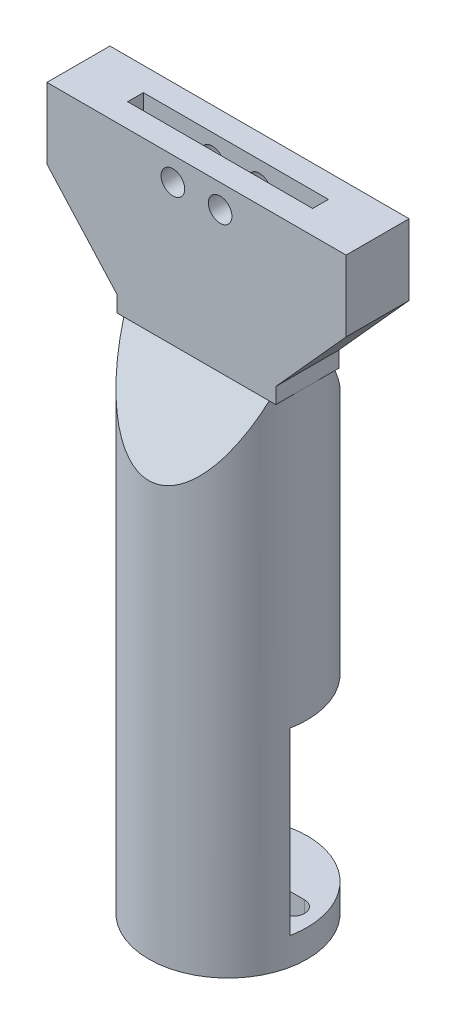
ISO-10303-21;
HEADER;
FILE_DESCRIPTION(('STEP AP214'),'2;1');
FILE_NAME('part.step','',(''),(''),'','','');
FILE_SCHEMA(('AUTOMOTIVE_DESIGN { 1 0 10303 214 1 1 1 1 }'));
ENDSEC;
DATA;
#1=APPLICATION_CONTEXT('core data for automotive mechanical design processes');
#2=APPLICATION_PROTOCOL_DEFINITION('international standard','automotive_design',2000,#1);
#3=PRODUCT_CONTEXT('',#1,'mechanical');
#4=PRODUCT('Part','Part','',(#3));
#5=PRODUCT_RELATED_PRODUCT_CATEGORY('part','',(#4));
#6=PRODUCT_DEFINITION_FORMATION('','',#4);
#7=PRODUCT_DEFINITION_CONTEXT('part definition',#1,'design');
#8=PRODUCT_DEFINITION('design','',#6,#7);
#9=PRODUCT_DEFINITION_SHAPE('','',#8);
#10=(LENGTH_UNIT() NAMED_UNIT(*) SI_UNIT(.MILLI.,.METRE.));
#11=(NAMED_UNIT(*) PLANE_ANGLE_UNIT() SI_UNIT($,.RADIAN.));
#12=(NAMED_UNIT(*) SI_UNIT($,.STERADIAN.) SOLID_ANGLE_UNIT());
#13=UNCERTAINTY_MEASURE_WITH_UNIT(LENGTH_MEASURE(1.E-05),#10,'distance_accuracy_value','');
#14=(GEOMETRIC_REPRESENTATION_CONTEXT(3) GLOBAL_UNCERTAINTY_ASSIGNED_CONTEXT((#13)) GLOBAL_UNIT_ASSIGNED_CONTEXT((#10,
#11,#12)) REPRESENTATION_CONTEXT('',''));
#15=CARTESIAN_POINT('',(0.,0.,0.));
#16=DIRECTION('',(0.,0.,1.));
#17=DIRECTION('',(1.,0.,0.));
#18=AXIS2_PLACEMENT_3D('',#15,#16,#17);
#19=CARTESIAN_POINT('',(19.,-83.9189161372576,4.));
#20=DIRECTION('',(0.,1.,0.));
#21=DIRECTION('',(-1.,0.,0.));
#22=AXIS2_PLACEMENT_3D('',#19,#20,#21);
#23=CYLINDRICAL_SURFACE('',#22,10.0689677949621);
#24=CARTESIAN_POINT('',(19.,-14.0958909977256,4.));
#25=DIRECTION('',(0.,0.505747316246845,-0.862681663250769));
#26=DIRECTION('',(0.,0.862681663250769,0.505747316246845));
#27=AXIS2_PLACEMENT_3D('',#24,#25,#26);
#28=ELLIPSE('',#27,19.9090879407607,10.0689677949621);
#29=CARTESIAN_POINT('',(28.2403523989069,-20.9189161372576,0.));
#30=VERTEX_POINT('',#29);
#31=CARTESIAN_POINT('',(9.75964760109312,-20.9189161372576,0.));
#32=VERTEX_POINT('',#31);
#33=EDGE_CURVE('E337',#30,#32,#28,.T.);
#34=ORIENTED_EDGE('',*,*,#33,.F.);
#35=CARTESIAN_POINT('',(19.,-20.9189161372576,4.));
#36=DIRECTION('',(0.,-1.,0.));
#37=DIRECTION('',(1.,0.,0.));
#38=AXIS2_PLACEMENT_3D('',#35,#36,#37);
#39=CIRCLE('',#38,10.0689677949621);
#40=CARTESIAN_POINT('',(29.0689677949621,-20.9189161372576,4.));
#41=VERTEX_POINT('',#40);
#42=EDGE_CURVE('E271',#30,#41,#39,.T.);
#43=ORIENTED_EDGE('',*,*,#42,.T.);
#44=CARTESIAN_POINT('',(28.2403523989069,-20.9189161372576,8.));
#45=VERTEX_POINT('',#44);
#46=EDGE_CURVE('E263',#41,#45,#39,.T.);
#47=ORIENTED_EDGE('',*,*,#46,.T.);
#48=CARTESIAN_POINT('',(19.,-14.0958909977256,4.));
#49=DIRECTION('',(0.,0.505747316246845,0.862681663250769));
#50=DIRECTION('',(0.,0.862681663250769,-0.505747316246845));
#51=AXIS2_PLACEMENT_3D('',#48,#49,#50);
#52=ELLIPSE('',#51,19.9090879407607,10.0689677949621);
#53=CARTESIAN_POINT('',(9.75964760109309,-20.9189161372576,8.));
#54=VERTEX_POINT('',#53);
#55=EDGE_CURVE('E261',#54,#45,#52,.T.);
#56=ORIENTED_EDGE('',*,*,#55,.F.);
#57=CARTESIAN_POINT('',(8.93103220503786,-20.9189161372576,4.));
#58=VERTEX_POINT('',#57);
#59=EDGE_CURVE('E270',#54,#58,#39,.T.);
#60=ORIENTED_EDGE('',*,*,#59,.T.);
#61=EDGE_CURVE('E443',#58,#32,#39,.T.);
#62=ORIENTED_EDGE('',*,*,#61,.T.);
#63=EDGE_LOOP('',(#34,#43,#47,#56,#60,#62));
#64=FACE_BOUND('',#63,.T.);
#65=CARTESIAN_POINT('',(19.,-83.9189161372576,4.));
#66=DIRECTION('',(0.,-1.,0.));
#67=DIRECTION('',(1.,0.,0.));
#68=AXIS2_PLACEMENT_3D('',#65,#66,#67);
#69=CIRCLE('',#68,10.0689677949621);
#70=CARTESIAN_POINT('',(29.0689677949621,-83.9189161372576,4.));
#71=VERTEX_POINT('',#70);
#72=EDGE_CURVE('E264',#71,#71,#69,.T.);
#73=ORIENTED_EDGE('',*,*,#72,.F.);
#74=EDGE_LOOP('',(#73));
#75=FACE_BOUND('',#74,.T.);
#76=DIRECTION('',(0.,1.,0.));
#77=VECTOR('',#76,1.);
#78=CARTESIAN_POINT('',(28.8646845317479,-83.9189161372576,6.01794735934259));
#79=LINE('',#78,#77);
#80=CARTESIAN_POINT('',(28.8646845317479,-57.5950061167622,6.01794735934259));
#81=VERTEX_POINT('',#80);
#82=CARTESIAN_POINT('',(28.8646845317479,-80.4189161372576,6.01794735934259));
#83=VERTEX_POINT('',#82);
#84=EDGE_CURVE('E345',#81,#83,#79,.F.);
#85=ORIENTED_EDGE('',*,*,#84,.F.);
#86=CARTESIAN_POINT('',(19.,-57.5950061167622,4.));
#87=DIRECTION('',(0.,-1.,0.));
#88=DIRECTION('',(0.,0.,-1.));
#89=AXIS2_PLACEMENT_3D('',#86,#87,#88);
#90=CIRCLE('',#89,10.0689677949621);
#91=CARTESIAN_POINT('',(9.13531546825209,-57.5950061167622,6.01794735934259));
#92=VERTEX_POINT('',#91);
#93=EDGE_CURVE('E350',#92,#81,#90,.T.);
#94=ORIENTED_EDGE('',*,*,#93,.F.);
#95=DIRECTION('',(0.,1.,0.));
#96=VECTOR('',#95,1.);
#97=CARTESIAN_POINT('',(9.13531546825208,-83.9189161372576,6.01794735934259));
#98=LINE('',#97,#96);
#99=CARTESIAN_POINT('',(9.13531546825208,-80.4189161372576,6.01794735934259));
#100=VERTEX_POINT('',#99);
#101=EDGE_CURVE('E348',#100,#92,#98,.T.);
#102=ORIENTED_EDGE('',*,*,#101,.F.);
#103=CARTESIAN_POINT('',(19.,-80.4189161372576,4.));
#104=DIRECTION('',(0.,1.,0.));
#105=DIRECTION('',(0.,0.,1.));
#106=AXIS2_PLACEMENT_3D('',#103,#104,#105);
#107=CIRCLE('',#106,10.0689677949621);
#108=EDGE_CURVE('E339',#83,#100,#107,.T.);
#109=ORIENTED_EDGE('',*,*,#108,.F.);
#110=EDGE_LOOP('',(#85,#94,#102,#109));
#111=FACE_BOUND('',#110,.T.);
#112=ADVANCED_FACE('F33',(#64,#75,#111),#23,.T.);
#113=CARTESIAN_POINT('',(16.,-3.,10.));
#114=DIRECTION('',(0.,0.,-1.));
#115=DIRECTION('',(-1.,0.,0.));
#116=AXIS2_PLACEMENT_3D('',#113,#114,#115);
#117=CYLINDRICAL_SURFACE('',#116,1.5);
#118=CARTESIAN_POINT('',(16.,-3.,3.));
#119=DIRECTION('',(0.,0.,-1.));
#120=DIRECTION('',(-1.,0.,0.));
#121=AXIS2_PLACEMENT_3D('',#118,#119,#120);
#122=CIRCLE('',#121,1.5);
#123=CARTESIAN_POINT('',(14.5,-3.,3.));
#124=VERTEX_POINT('',#123);
#125=EDGE_CURVE('E246',#124,#124,#122,.F.);
#126=ORIENTED_EDGE('',*,*,#125,.T.);
#127=EDGE_LOOP('',(#126));
#128=FACE_BOUND('',#127,.T.);
#129=CARTESIAN_POINT('',(16.,-3.,0.));
#130=DIRECTION('',(0.,0.,-1.));
#131=DIRECTION('',(-1.,0.,0.));
#132=AXIS2_PLACEMENT_3D('',#129,#130,#131);
#133=CIRCLE('',#132,1.5);
#134=CARTESIAN_POINT('',(14.5,-3.,0.));
#135=VERTEX_POINT('',#134);
#136=EDGE_CURVE('E249',#135,#135,#133,.T.);
#137=ORIENTED_EDGE('',*,*,#136,.T.);
#138=EDGE_LOOP('',(#137));
#139=FACE_BOUND('',#138,.T.);
#140=ADVANCED_FACE('F374',(#128,#139),#117,.F.);
#141=CARTESIAN_POINT('',(22.,-3.,10.));
#142=DIRECTION('',(0.,0.,-1.));
#143=DIRECTION('',(-1.,0.,0.));
#144=AXIS2_PLACEMENT_3D('',#141,#142,#143);
#145=CYLINDRICAL_SURFACE('',#144,1.5);
#146=CARTESIAN_POINT('',(22.,-3.,3.));
#147=DIRECTION('',(0.,0.,-1.));
#148=DIRECTION('',(-1.,0.,0.));
#149=AXIS2_PLACEMENT_3D('',#146,#147,#148);
#150=CIRCLE('',#149,1.5);
#151=CARTESIAN_POINT('',(20.5,-3.,3.));
#152=VERTEX_POINT('',#151);
#153=EDGE_CURVE('E245',#152,#152,#150,.F.);
#154=ORIENTED_EDGE('',*,*,#153,.T.);
#155=EDGE_LOOP('',(#154));
#156=FACE_BOUND('',#155,.T.);
#157=CARTESIAN_POINT('',(22.,-3.,0.));
#158=DIRECTION('',(0.,0.,-1.));
#159=DIRECTION('',(-1.,0.,0.));
#160=AXIS2_PLACEMENT_3D('',#157,#158,#159);
#161=CIRCLE('',#160,1.5);
#162=CARTESIAN_POINT('',(20.5,-3.,0.));
#163=VERTEX_POINT('',#162);
#164=EDGE_CURVE('E250',#163,#163,#161,.T.);
#165=ORIENTED_EDGE('',*,*,#164,.T.);
#166=EDGE_LOOP('',(#165));
#167=FACE_BOUND('',#166,.T.);
#168=ADVANCED_FACE('F380',(#156,#167),#145,.F.);
#169=CARTESIAN_POINT('',(8.93103220503786,-20.9189161372576,8.));
#170=DIRECTION('',(0.,1.,0.));
#171=DIRECTION('',(-1.,0.,0.));
#172=AXIS2_PLACEMENT_3D('',#169,#170,#171);
#173=PLANE('',#172);
#174=ORIENTED_EDGE('',*,*,#59,.F.);
#175=DIRECTION('',(1.,0.,0.));
#176=VECTOR('',#175,1.);
#177=CARTESIAN_POINT('',(8.93103220503786,-20.9189161372576,8.));
#178=LINE('',#177,#176);
#179=CARTESIAN_POINT('',(8.93103220503786,-20.9189161372576,8.));
#180=VERTEX_POINT('',#179);
#181=EDGE_CURVE('E281',#180,#54,#178,.T.);
#182=ORIENTED_EDGE('',*,*,#181,.F.);
#183=DIRECTION('',(0.,0.,-1.));
#184=VECTOR('',#183,1.);
#185=CARTESIAN_POINT('',(8.93103220503786,-20.9189161372576,8.));
#186=LINE('',#185,#184);
#187=EDGE_CURVE('E328',#180,#58,#186,.T.);
#188=ORIENTED_EDGE('',*,*,#187,.T.);
#189=EDGE_LOOP('',(#174,#182,#188));
#190=FACE_BOUND('',#189,.T.);
#191=ADVANCED_FACE('F417',(#190),#173,.F.);
#192=ORIENTED_EDGE('',*,*,#61,.F.);
#193=CARTESIAN_POINT('',(8.93103220503786,-20.9189161372576,0.));
#194=VERTEX_POINT('',#193);
#195=EDGE_CURVE('E327',#58,#194,#186,.T.);
#196=ORIENTED_EDGE('',*,*,#195,.T.);
#197=DIRECTION('',(1.,0.,0.));
#198=VECTOR('',#197,1.);
#199=CARTESIAN_POINT('',(8.93103220503786,-20.9189161372576,0.));
#200=LINE('',#199,#198);
#201=EDGE_CURVE('E302',#194,#32,#200,.T.);
#202=ORIENTED_EDGE('',*,*,#201,.T.);
#203=EDGE_LOOP('',(#192,#196,#202));
#204=FACE_BOUND('',#203,.T.);
#205=ADVANCED_FACE('F442',(#204),#173,.F.);
#206=ORIENTED_EDGE('',*,*,#46,.F.);
#207=DIRECTION('',(0.,0.,-1.));
#208=VECTOR('',#207,1.);
#209=CARTESIAN_POINT('',(29.0689677949621,-20.9189161372576,8.));
#210=LINE('',#209,#208);
#211=CARTESIAN_POINT('',(29.0689677949621,-20.9189161372576,8.));
#212=VERTEX_POINT('',#211);
#213=EDGE_CURVE('E325',#212,#41,#210,.T.);
#214=ORIENTED_EDGE('',*,*,#213,.F.);
#215=EDGE_CURVE('E280',#45,#212,#178,.T.);
#216=ORIENTED_EDGE('',*,*,#215,.F.);
#217=EDGE_LOOP('',(#206,#214,#216));
#218=FACE_BOUND('',#217,.T.);
#219=ADVANCED_FACE('F418',(#218),#173,.F.);
#220=CARTESIAN_POINT('',(0.,0.,8.));
#221=DIRECTION('',(1.,0.,0.));
#222=DIRECTION('',(0.,1.,0.));
#223=AXIS2_PLACEMENT_3D('',#220,#221,#222);
#224=PLANE('',#223);
#225=DIRECTION('',(0.,-1.,0.));
#226=VECTOR('',#225,1.);
#227=CARTESIAN_POINT('',(0.,0.,0.));
#228=LINE('',#227,#226);
#229=CARTESIAN_POINT('',(0.,0.,0.));
#230=VERTEX_POINT('',#229);
#231=CARTESIAN_POINT('',(0.,-9.,0.));
#232=VERTEX_POINT('',#231);
#233=EDGE_CURVE('E267',#230,#232,#228,.T.);
#234=ORIENTED_EDGE('',*,*,#233,.T.);
#235=DIRECTION('',(0.,0.,-1.));
#236=VECTOR('',#235,1.);
#237=CARTESIAN_POINT('',(0.,-9.,8.));
#238=LINE('',#237,#236);
#239=CARTESIAN_POINT('',(0.,-9.,8.));
#240=VERTEX_POINT('',#239);
#241=EDGE_CURVE('E334',#240,#232,#238,.T.);
#242=ORIENTED_EDGE('',*,*,#241,.F.);
#243=DIRECTION('',(0.,-1.,0.));
#244=VECTOR('',#243,1.);
#245=CARTESIAN_POINT('',(0.,0.,8.));
#246=LINE('',#245,#244);
#247=CARTESIAN_POINT('',(0.,0.,8.));
#248=VERTEX_POINT('',#247);
#249=EDGE_CURVE('E272',#248,#240,#246,.T.);
#250=ORIENTED_EDGE('',*,*,#249,.F.);
#251=DIRECTION('',(0.,0.,-1.));
#252=VECTOR('',#251,1.);
#253=CARTESIAN_POINT('',(0.,0.,8.));
#254=LINE('',#253,#252);
#255=EDGE_CURVE('E293',#248,#230,#254,.T.);
#256=ORIENTED_EDGE('',*,*,#255,.T.);
#257=EDGE_LOOP('',(#234,#242,#250,#256));
#258=FACE_BOUND('',#257,.T.);
#259=ADVANCED_FACE('F35',(#258),#224,.F.);
#260=CARTESIAN_POINT('',(0.,-9.,8.));
#261=DIRECTION('',(0.743144825477395,0.669130606358857,0.));
#262=DIRECTION('',(-0.669130606358857,0.743144825477395,0.));
#263=AXIS2_PLACEMENT_3D('',#260,#261,#262);
#264=PLANE('',#263);
#265=DIRECTION('',(0.669130606358857,-0.743144825477395,0.));
#266=VECTOR('',#265,1.);
#267=CARTESIAN_POINT('',(0.,-9.,0.));
#268=LINE('',#267,#266);
#269=CARTESIAN_POINT('',(8.93103220503786,-18.9189161372576,0.));
#270=VERTEX_POINT('',#269);
#271=EDGE_CURVE('E296',#232,#270,#268,.T.);
#272=ORIENTED_EDGE('',*,*,#271,.T.);
#273=DIRECTION('',(0.,0.,-1.));
#274=VECTOR('',#273,1.);
#275=CARTESIAN_POINT('',(8.93103220503786,-18.9189161372576,8.));
#276=LINE('',#275,#274);
#277=CARTESIAN_POINT('',(8.93103220503786,-18.9189161372576,8.));
#278=VERTEX_POINT('',#277);
#279=EDGE_CURVE('E331',#278,#270,#276,.T.);
#280=ORIENTED_EDGE('',*,*,#279,.F.);
#281=DIRECTION('',(0.669130606358857,-0.743144825477395,0.));
#282=VECTOR('',#281,1.);
#283=CARTESIAN_POINT('',(0.,-9.,8.));
#284=LINE('',#283,#282);
#285=EDGE_CURVE('E275',#240,#278,#284,.T.);
#286=ORIENTED_EDGE('',*,*,#285,.F.);
#287=ORIENTED_EDGE('',*,*,#241,.T.);
#288=EDGE_LOOP('',(#272,#280,#286,#287));
#289=FACE_BOUND('',#288,.T.);
#290=ADVANCED_FACE('F420',(#289),#264,.F.);
#291=CARTESIAN_POINT('',(8.93103220503786,-18.9189161372576,8.));
#292=DIRECTION('',(1.,0.,0.));
#293=DIRECTION('',(0.,1.,0.));
#294=AXIS2_PLACEMENT_3D('',#291,#292,#293);
#295=PLANE('',#294);
#296=DIRECTION('',(0.,-1.,0.));
#297=VECTOR('',#296,1.);
#298=CARTESIAN_POINT('',(8.93103220503786,-18.9189161372576,0.));
#299=LINE('',#298,#297);
#300=EDGE_CURVE('E298',#270,#194,#299,.T.);
#301=ORIENTED_EDGE('',*,*,#300,.T.);
#302=ORIENTED_EDGE('',*,*,#195,.F.);
#303=ORIENTED_EDGE('',*,*,#187,.F.);
#304=DIRECTION('',(0.,-1.,0.));
#305=VECTOR('',#304,1.);
#306=CARTESIAN_POINT('',(8.93103220503786,-18.9189161372576,8.));
#307=LINE('',#306,#305);
#308=EDGE_CURVE('E278',#278,#180,#307,.T.);
#309=ORIENTED_EDGE('',*,*,#308,.F.);
#310=ORIENTED_EDGE('',*,*,#279,.T.);
#311=EDGE_LOOP('',(#301,#302,#303,#309,#310));
#312=FACE_BOUND('',#311,.T.);
#313=ADVANCED_FACE('F415',(#312),#295,.F.);
#314=ORIENTED_EDGE('',*,*,#42,.F.);
#315=CARTESIAN_POINT('',(29.0689677949621,-20.9189161372576,0.));
#316=VERTEX_POINT('',#315);
#317=EDGE_CURVE('E301',#30,#316,#200,.T.);
#318=ORIENTED_EDGE('',*,*,#317,.T.);
#319=EDGE_CURVE('E324',#41,#316,#210,.T.);
#320=ORIENTED_EDGE('',*,*,#319,.F.);
#321=EDGE_LOOP('',(#314,#318,#320));
#322=FACE_BOUND('',#321,.T.);
#323=ADVANCED_FACE('F411',(#322),#173,.F.);
#324=CARTESIAN_POINT('',(29.0689677949621,-18.9189161372576,8.));
#325=DIRECTION('',(-1.,0.,0.));
#326=DIRECTION('',(0.,0.,1.));
#327=AXIS2_PLACEMENT_3D('',#324,#325,#326);
#328=PLANE('',#327);
#329=DIRECTION('',(0.,1.,0.));
#330=VECTOR('',#329,1.);
#331=CARTESIAN_POINT('',(29.0689677949621,-18.9189161372576,0.));
#332=LINE('',#331,#330);
#333=CARTESIAN_POINT('',(29.0689677949621,-18.9189161372576,0.));
#334=VERTEX_POINT('',#333);
#335=EDGE_CURVE('E305',#316,#334,#332,.T.);
#336=ORIENTED_EDGE('',*,*,#335,.T.);
#337=DIRECTION('',(0.,0.,-1.));
#338=VECTOR('',#337,1.);
#339=CARTESIAN_POINT('',(29.0689677949621,-18.9189161372576,8.));
#340=LINE('',#339,#338);
#341=CARTESIAN_POINT('',(29.0689677949621,-18.9189161372576,8.));
#342=VERTEX_POINT('',#341);
#343=EDGE_CURVE('E321',#342,#334,#340,.T.);
#344=ORIENTED_EDGE('',*,*,#343,.F.);
#345=DIRECTION('',(0.,1.,0.));
#346=VECTOR('',#345,1.);
#347=CARTESIAN_POINT('',(29.0689677949621,-18.9189161372576,8.));
#348=LINE('',#347,#346);
#349=EDGE_CURVE('E284',#212,#342,#348,.T.);
#350=ORIENTED_EDGE('',*,*,#349,.F.);
#351=ORIENTED_EDGE('',*,*,#213,.T.);
#352=ORIENTED_EDGE('',*,*,#319,.T.);
#353=EDGE_LOOP('',(#336,#344,#350,#351,#352));
#354=FACE_BOUND('',#353,.T.);
#355=ADVANCED_FACE('F407',(#354),#328,.F.);
#356=CARTESIAN_POINT('',(38.,-9.,8.));
#357=DIRECTION('',(-0.743144825477395,0.669130606358857,0.));
#358=DIRECTION('',(-0.669130606358857,-0.743144825477395,0.));
#359=AXIS2_PLACEMENT_3D('',#356,#357,#358);
#360=PLANE('',#359);
#361=DIRECTION('',(0.669130606358857,0.743144825477395,0.));
#362=VECTOR('',#361,1.);
#363=CARTESIAN_POINT('',(38.,-9.,0.));
#364=LINE('',#363,#362);
#365=CARTESIAN_POINT('',(38.,-9.,0.));
#366=VERTEX_POINT('',#365);
#367=EDGE_CURVE('E308',#334,#366,#364,.T.);
#368=ORIENTED_EDGE('',*,*,#367,.T.);
#369=DIRECTION('',(0.,0.,-1.));
#370=VECTOR('',#369,1.);
#371=CARTESIAN_POINT('',(38.,-9.,8.));
#372=LINE('',#371,#370);
#373=CARTESIAN_POINT('',(38.,-9.,8.));
#374=VERTEX_POINT('',#373);
#375=EDGE_CURVE('E318',#374,#366,#372,.T.);
#376=ORIENTED_EDGE('',*,*,#375,.F.);
#377=DIRECTION('',(0.669130606358857,0.743144825477395,0.));
#378=VECTOR('',#377,1.);
#379=CARTESIAN_POINT('',(38.,-9.,8.));
#380=LINE('',#379,#378);
#381=EDGE_CURVE('E287',#342,#374,#380,.T.);
#382=ORIENTED_EDGE('',*,*,#381,.F.);
#383=ORIENTED_EDGE('',*,*,#343,.T.);
#384=EDGE_LOOP('',(#368,#376,#382,#383));
#385=FACE_BOUND('',#384,.T.);
#386=ADVANCED_FACE('F403',(#385),#360,.F.);
#387=CARTESIAN_POINT('',(38.,0.,8.));
#388=DIRECTION('',(-1.,0.,0.));
#389=DIRECTION('',(0.,0.,1.));
#390=AXIS2_PLACEMENT_3D('',#387,#388,#389);
#391=PLANE('',#390);
#392=DIRECTION('',(0.,1.,0.));
#393=VECTOR('',#392,1.);
#394=CARTESIAN_POINT('',(38.,0.,0.));
#395=LINE('',#394,#393);
#396=CARTESIAN_POINT('',(38.,0.,0.));
#397=VERTEX_POINT('',#396);
#398=EDGE_CURVE('E310',#366,#397,#395,.T.);
#399=ORIENTED_EDGE('',*,*,#398,.T.);
#400=DIRECTION('',(0.,0.,-1.));
#401=VECTOR('',#400,1.);
#402=CARTESIAN_POINT('',(38.,0.,8.));
#403=LINE('',#402,#401);
#404=CARTESIAN_POINT('',(38.,0.,8.));
#405=VERTEX_POINT('',#404);
#406=EDGE_CURVE('E315',#405,#397,#403,.T.);
#407=ORIENTED_EDGE('',*,*,#406,.F.);
#408=DIRECTION('',(0.,1.,0.));
#409=VECTOR('',#408,1.);
#410=CARTESIAN_POINT('',(38.,0.,8.));
#411=LINE('',#410,#409);
#412=EDGE_CURVE('E289',#374,#405,#411,.T.);
#413=ORIENTED_EDGE('',*,*,#412,.F.);
#414=ORIENTED_EDGE('',*,*,#375,.T.);
#415=EDGE_LOOP('',(#399,#407,#413,#414));
#416=FACE_BOUND('',#415,.T.);
#417=ADVANCED_FACE('F399',(#416),#391,.F.);
#418=CARTESIAN_POINT('',(0.,0.,8.));
#419=DIRECTION('',(0.,-1.,0.));
#420=DIRECTION('',(0.,0.,-1.));
#421=AXIS2_PLACEMENT_3D('',#418,#419,#420);
#422=PLANE('',#421);
#423=DIRECTION('',(1.,0.,0.));
#424=VECTOR('',#423,1.);
#425=CARTESIAN_POINT('',(7.25,0.,5.));
#426=LINE('',#425,#424);
#427=CARTESIAN_POINT('',(7.25,0.,5.));
#428=VERTEX_POINT('',#427);
#429=CARTESIAN_POINT('',(30.75,0.,5.));
#430=VERTEX_POINT('',#429);
#431=EDGE_CURVE('E225',#428,#430,#426,.T.);
#432=ORIENTED_EDGE('',*,*,#431,.F.);
#433=DIRECTION('',(0.,0.,1.));
#434=VECTOR('',#433,1.);
#435=CARTESIAN_POINT('',(7.25,0.,3.));
#436=LINE('',#435,#434);
#437=CARTESIAN_POINT('',(7.25,0.,3.));
#438=VERTEX_POINT('',#437);
#439=EDGE_CURVE('E209',#438,#428,#436,.T.);
#440=ORIENTED_EDGE('',*,*,#439,.F.);
#441=DIRECTION('',(-1.,0.,0.));
#442=VECTOR('',#441,1.);
#443=CARTESIAN_POINT('',(7.25,0.,3.));
#444=LINE('',#443,#442);
#445=CARTESIAN_POINT('',(30.75,0.,3.));
#446=VERTEX_POINT('',#445);
#447=EDGE_CURVE('E214',#446,#438,#444,.T.);
#448=ORIENTED_EDGE('',*,*,#447,.F.);
#449=DIRECTION('',(0.,0.,-1.));
#450=VECTOR('',#449,1.);
#451=CARTESIAN_POINT('',(30.75,0.,3.));
#452=LINE('',#451,#450);
#453=EDGE_CURVE('E228',#430,#446,#452,.T.);
#454=ORIENTED_EDGE('',*,*,#453,.F.);
#455=EDGE_LOOP('',(#432,#440,#448,#454));
#456=FACE_BOUND('',#455,.T.);
#457=DIRECTION('',(-1.,0.,0.));
#458=VECTOR('',#457,1.);
#459=CARTESIAN_POINT('',(0.,0.,0.));
#460=LINE('',#459,#458);
#461=EDGE_CURVE('E276',#397,#230,#460,.T.);
#462=ORIENTED_EDGE('',*,*,#461,.T.);
#463=ORIENTED_EDGE('',*,*,#255,.F.);
#464=DIRECTION('',(-1.,0.,0.));
#465=VECTOR('',#464,1.);
#466=CARTESIAN_POINT('',(0.,0.,8.));
#467=LINE('',#466,#465);
#468=EDGE_CURVE('E291',#405,#248,#467,.T.);
#469=ORIENTED_EDGE('',*,*,#468,.F.);
#470=ORIENTED_EDGE('',*,*,#406,.T.);
#471=EDGE_LOOP('',(#462,#463,#469,#470));
#472=FACE_BOUND('',#471,.T.);
#473=ADVANCED_FACE('F392',(#456,#472),#422,.F.);
#474=CARTESIAN_POINT('',(0.,0.,8.));
#475=DIRECTION('',(0.,0.,1.));
#476=DIRECTION('',(1.,0.,0.));
#477=AXIS2_PLACEMENT_3D('',#474,#475,#476);
#478=PLANE('',#477);
#479=CARTESIAN_POINT('',(22.,-3.,8.));
#480=DIRECTION('',(0.,0.,1.));
#481=DIRECTION('',(1.,0.,0.));
#482=AXIS2_PLACEMENT_3D('',#479,#480,#481);
#483=CIRCLE('',#482,1.5);
#484=CARTESIAN_POINT('',(23.5,-3.,8.));
#485=VERTEX_POINT('',#484);
#486=EDGE_CURVE('E258',#485,#485,#483,.T.);
#487=ORIENTED_EDGE('',*,*,#486,.F.);
#488=EDGE_LOOP('',(#487));
#489=FACE_BOUND('',#488,.T.);
#490=CARTESIAN_POINT('',(16.,-3.,8.));
#491=DIRECTION('',(0.,0.,1.));
#492=DIRECTION('',(1.,0.,0.));
#493=AXIS2_PLACEMENT_3D('',#490,#491,#492);
#494=CIRCLE('',#493,1.5);
#495=CARTESIAN_POINT('',(17.5,-3.,8.));
#496=VERTEX_POINT('',#495);
#497=EDGE_CURVE('E253',#496,#496,#494,.T.);
#498=ORIENTED_EDGE('',*,*,#497,.F.);
#499=EDGE_LOOP('',(#498));
#500=FACE_BOUND('',#499,.T.);
#501=ORIENTED_EDGE('',*,*,#249,.T.);
#502=ORIENTED_EDGE('',*,*,#285,.T.);
#503=ORIENTED_EDGE('',*,*,#308,.T.);
#504=ORIENTED_EDGE('',*,*,#181,.T.);
#505=EDGE_CURVE('E285',#54,#45,#178,.T.);
#506=ORIENTED_EDGE('',*,*,#505,.T.);
#507=ORIENTED_EDGE('',*,*,#215,.T.);
#508=ORIENTED_EDGE('',*,*,#349,.T.);
#509=ORIENTED_EDGE('',*,*,#381,.T.);
#510=ORIENTED_EDGE('',*,*,#412,.T.);
#511=ORIENTED_EDGE('',*,*,#468,.T.);
#512=EDGE_LOOP('',(#501,#502,#503,#504,#506,#507,#508,#509,#510,#511));
#513=FACE_BOUND('',#512,.T.);
#514=ADVANCED_FACE('F388',(#489,#500,#513),#478,.T.);
#515=CARTESIAN_POINT('',(0.,0.,0.));
#516=DIRECTION('',(0.,0.,1.));
#517=DIRECTION('',(1.,0.,0.));
#518=AXIS2_PLACEMENT_3D('',#515,#516,#517);
#519=PLANE('',#518);
#520=ORIENTED_EDGE('',*,*,#164,.F.);
#521=EDGE_LOOP('',(#520));
#522=FACE_BOUND('',#521,.T.);
#523=ORIENTED_EDGE('',*,*,#136,.F.);
#524=EDGE_LOOP('',(#523));
#525=FACE_BOUND('',#524,.T.);
#526=ORIENTED_EDGE('',*,*,#233,.F.);
#527=ORIENTED_EDGE('',*,*,#461,.F.);
#528=ORIENTED_EDGE('',*,*,#398,.F.);
#529=ORIENTED_EDGE('',*,*,#367,.F.);
#530=ORIENTED_EDGE('',*,*,#335,.F.);
#531=ORIENTED_EDGE('',*,*,#317,.F.);
#532=EDGE_CURVE('E306',#32,#30,#200,.T.);
#533=ORIENTED_EDGE('',*,*,#532,.F.);
#534=ORIENTED_EDGE('',*,*,#201,.F.);
#535=ORIENTED_EDGE('',*,*,#300,.F.);
#536=ORIENTED_EDGE('',*,*,#271,.F.);
#537=EDGE_LOOP('',(#526,#527,#528,#529,#530,#531,#533,#534,#535,#536));
#538=FACE_BOUND('',#537,.T.);
#539=ADVANCED_FACE('F391',(#522,#525,#538),#519,.F.);
#540=CARTESIAN_POINT('',(19.,-83.9189161372576,4.));
#541=DIRECTION('',(0.,-1.,0.));
#542=DIRECTION('',(1.,0.,0.));
#543=AXIS2_PLACEMENT_3D('',#540,#541,#542);
#544=PLANE('',#543);
#545=CARTESIAN_POINT('',(12.6239241814187,-83.9189161372576,2.6428006342627));
#546=DIRECTION('',(0.,-1.,0.));
#547=DIRECTION('',(1.,0.,0.));
#548=AXIS2_PLACEMENT_3D('',#545,#546,#547);
#549=CIRCLE('',#548,1.5);
#550=CARTESIAN_POINT('',(12.6239241814187,-83.9189161372576,4.1428006342627));
#551=VERTEX_POINT('',#550);
#552=CARTESIAN_POINT('',(12.6239241814187,-83.9189161372576,1.1428006342627));
#553=VERTEX_POINT('',#552);
#554=EDGE_CURVE('E48',#551,#553,#549,.T.);
#555=ORIENTED_EDGE('',*,*,#554,.F.);
#556=DIRECTION('',(-1.,0.,0.));
#557=VECTOR('',#556,1.);
#558=CARTESIAN_POINT('',(12.6239241814187,-83.9189161372576,4.1428006342627));
#559=LINE('',#558,#557);
#560=CARTESIAN_POINT('',(25.8644585838897,-83.9189161372576,4.1428006342627));
#561=VERTEX_POINT('',#560);
#562=EDGE_CURVE('E194',#561,#551,#559,.T.);
#563=ORIENTED_EDGE('',*,*,#562,.F.);
#564=CARTESIAN_POINT('',(25.8644585838897,-83.9189161372576,2.6428006342627));
#565=DIRECTION('',(0.,-1.,0.));
#566=DIRECTION('',(1.,0.,0.));
#567=AXIS2_PLACEMENT_3D('',#564,#565,#566);
#568=CIRCLE('',#567,1.5);
#569=CARTESIAN_POINT('',(25.8644585838897,-83.9189161372576,1.1428006342627));
#570=VERTEX_POINT('',#569);
#571=EDGE_CURVE('E178',#570,#561,#568,.T.);
#572=ORIENTED_EDGE('',*,*,#571,.F.);
#573=DIRECTION('',(1.,0.,0.));
#574=VECTOR('',#573,1.);
#575=CARTESIAN_POINT('',(12.6239241814187,-83.9189161372576,1.1428006342627));
#576=LINE('',#575,#574);
#577=EDGE_CURVE('E187',#553,#570,#576,.T.);
#578=ORIENTED_EDGE('',*,*,#577,.F.);
#579=EDGE_LOOP('',(#555,#563,#572,#578));
#580=FACE_BOUND('',#579,.T.);
#581=ORIENTED_EDGE('',*,*,#72,.T.);
#582=EDGE_LOOP('',(#581));
#583=FACE_BOUND('',#582,.T.);
#584=ADVANCED_FACE('F191',(#580,#583),#544,.T.);
#585=CARTESIAN_POINT('',(83.,-20.9189161372576,8.));
#586=DIRECTION('',(0.,0.505747316246845,0.862681663250769));
#587=DIRECTION('',(0.,-0.862681663250769,0.505747316246845));
#588=AXIS2_PLACEMENT_3D('',#585,#586,#587);
#589=PLANE('',#588);
#590=ORIENTED_EDGE('',*,*,#55,.T.);
#591=ORIENTED_EDGE('',*,*,#505,.F.);
#592=EDGE_LOOP('',(#590,#591));
#593=FACE_BOUND('',#592,.T.);
#594=ADVANCED_FACE('F457',(#593),#589,.T.);
#595=CARTESIAN_POINT('',(83.,-20.9189161372576,0.));
#596=DIRECTION('',(0.,0.505747316246845,-0.862681663250769));
#597=DIRECTION('',(0.,0.862681663250769,0.505747316246845));
#598=AXIS2_PLACEMENT_3D('',#595,#596,#597);
#599=PLANE('',#598);
#600=ORIENTED_EDGE('',*,*,#532,.T.);
#601=ORIENTED_EDGE('',*,*,#33,.T.);
#602=EDGE_LOOP('',(#600,#601));
#603=FACE_BOUND('',#602,.T.);
#604=ADVANCED_FACE('F455',(#603),#599,.T.);
#605=CARTESIAN_POINT('',(16.,-3.,5.));
#606=DIRECTION('',(0.,0.,1.));
#607=DIRECTION('',(1.,0.,0.));
#608=AXIS2_PLACEMENT_3D('',#605,#606,#607);
#609=CIRCLE('',#608,1.5);
#610=CARTESIAN_POINT('',(17.5,-3.,5.));
#611=VERTEX_POINT('',#610);
#612=EDGE_CURVE('E242',#611,#611,#609,.F.);
#613=ORIENTED_EDGE('',*,*,#612,.T.);
#614=EDGE_LOOP('',(#613));
#615=FACE_BOUND('',#614,.T.);
#616=ORIENTED_EDGE('',*,*,#497,.T.);
#617=EDGE_LOOP('',(#616));
#618=FACE_BOUND('',#617,.T.);
#619=ADVANCED_FACE('F383',(#615,#618),#117,.F.);
#620=CARTESIAN_POINT('',(22.,-3.,5.));
#621=DIRECTION('',(0.,0.,1.));
#622=DIRECTION('',(1.,0.,0.));
#623=AXIS2_PLACEMENT_3D('',#620,#621,#622);
#624=CIRCLE('',#623,1.5);
#625=CARTESIAN_POINT('',(23.5,-3.,5.));
#626=VERTEX_POINT('',#625);
#627=EDGE_CURVE('E235',#626,#626,#624,.F.);
#628=ORIENTED_EDGE('',*,*,#627,.T.);
#629=EDGE_LOOP('',(#628));
#630=FACE_BOUND('',#629,.T.);
#631=ORIENTED_EDGE('',*,*,#486,.T.);
#632=EDGE_LOOP('',(#631));
#633=FACE_BOUND('',#632,.T.);
#634=ADVANCED_FACE('F463',(#630,#633),#145,.F.);
#635=CARTESIAN_POINT('',(7.25,-8.,3.));
#636=DIRECTION('',(0.,0.,-1.));
#637=DIRECTION('',(-1.,0.,0.));
#638=AXIS2_PLACEMENT_3D('',#635,#636,#637);
#639=PLANE('',#638);
#640=ORIENTED_EDGE('',*,*,#153,.F.);
#641=EDGE_LOOP('',(#640));
#642=FACE_BOUND('',#641,.T.);
#643=ORIENTED_EDGE('',*,*,#447,.T.);
#644=DIRECTION('',(0.,1.,0.));
#645=VECTOR('',#644,1.);
#646=CARTESIAN_POINT('',(7.25,-8.,3.));
#647=LINE('',#646,#645);
#648=CARTESIAN_POINT('',(7.25,-8.,3.));
#649=VERTEX_POINT('',#648);
#650=EDGE_CURVE('E233',#649,#438,#647,.T.);
#651=ORIENTED_EDGE('',*,*,#650,.F.);
#652=DIRECTION('',(-1.,0.,0.));
#653=VECTOR('',#652,1.);
#654=CARTESIAN_POINT('',(7.25,-8.,3.));
#655=LINE('',#654,#653);
#656=CARTESIAN_POINT('',(30.75,-8.,3.));
#657=VERTEX_POINT('',#656);
#658=EDGE_CURVE('E220',#657,#649,#655,.T.);
#659=ORIENTED_EDGE('',*,*,#658,.F.);
#660=DIRECTION('',(0.,1.,0.));
#661=VECTOR('',#660,1.);
#662=CARTESIAN_POINT('',(30.75,-8.,3.));
#663=LINE('',#662,#661);
#664=EDGE_CURVE('E236',#657,#446,#663,.T.);
#665=ORIENTED_EDGE('',*,*,#664,.T.);
#666=EDGE_LOOP('',(#643,#651,#659,#665));
#667=FACE_BOUND('',#666,.T.);
#668=ORIENTED_EDGE('',*,*,#125,.F.);
#669=EDGE_LOOP('',(#668));
#670=FACE_BOUND('',#669,.T.);
#671=ADVANCED_FACE('F469',(#642,#667,#670),#639,.F.);
#672=CARTESIAN_POINT('',(7.25,-8.,5.));
#673=DIRECTION('',(0.,0.,1.));
#674=DIRECTION('',(1.,0.,0.));
#675=AXIS2_PLACEMENT_3D('',#672,#673,#674);
#676=PLANE('',#675);
#677=ORIENTED_EDGE('',*,*,#627,.F.);
#678=EDGE_LOOP('',(#677));
#679=FACE_BOUND('',#678,.T.);
#680=ORIENTED_EDGE('',*,*,#431,.T.);
#681=DIRECTION('',(0.,1.,0.));
#682=VECTOR('',#681,1.);
#683=CARTESIAN_POINT('',(30.75,-8.,5.));
#684=LINE('',#683,#682);
#685=CARTESIAN_POINT('',(30.75,-8.,5.));
#686=VERTEX_POINT('',#685);
#687=EDGE_CURVE('E238',#686,#430,#684,.T.);
#688=ORIENTED_EDGE('',*,*,#687,.F.);
#689=DIRECTION('',(1.,0.,0.));
#690=VECTOR('',#689,1.);
#691=CARTESIAN_POINT('',(7.25,-8.,5.));
#692=LINE('',#691,#690);
#693=CARTESIAN_POINT('',(7.25,-8.,5.));
#694=VERTEX_POINT('',#693);
#695=EDGE_CURVE('E213',#694,#686,#692,.T.);
#696=ORIENTED_EDGE('',*,*,#695,.F.);
#697=DIRECTION('',(0.,1.,0.));
#698=VECTOR('',#697,1.);
#699=CARTESIAN_POINT('',(7.25,-8.,5.));
#700=LINE('',#699,#698);
#701=EDGE_CURVE('E223',#694,#428,#700,.T.);
#702=ORIENTED_EDGE('',*,*,#701,.T.);
#703=EDGE_LOOP('',(#680,#688,#696,#702));
#704=FACE_BOUND('',#703,.T.);
#705=ORIENTED_EDGE('',*,*,#612,.F.);
#706=EDGE_LOOP('',(#705));
#707=FACE_BOUND('',#706,.T.);
#708=ADVANCED_FACE('F475',(#679,#704,#707),#676,.F.);
#709=CARTESIAN_POINT('',(7.25,-8.,3.));
#710=DIRECTION('',(-1.,0.,0.));
#711=DIRECTION('',(0.,0.,1.));
#712=AXIS2_PLACEMENT_3D('',#709,#710,#711);
#713=PLANE('',#712);
#714=ORIENTED_EDGE('',*,*,#439,.T.);
#715=ORIENTED_EDGE('',*,*,#701,.F.);
#716=DIRECTION('',(0.,0.,1.));
#717=VECTOR('',#716,1.);
#718=CARTESIAN_POINT('',(7.25,-8.,3.));
#719=LINE('',#718,#717);
#720=EDGE_CURVE('E210',#649,#694,#719,.T.);
#721=ORIENTED_EDGE('',*,*,#720,.F.);
#722=ORIENTED_EDGE('',*,*,#650,.T.);
#723=EDGE_LOOP('',(#714,#715,#721,#722));
#724=FACE_BOUND('',#723,.T.);
#725=ADVANCED_FACE('F471',(#724),#713,.F.);
#726=CARTESIAN_POINT('',(30.75,-8.,3.));
#727=DIRECTION('',(1.,0.,0.));
#728=DIRECTION('',(0.,0.,-1.));
#729=AXIS2_PLACEMENT_3D('',#726,#727,#728);
#730=PLANE('',#729);
#731=ORIENTED_EDGE('',*,*,#453,.T.);
#732=ORIENTED_EDGE('',*,*,#664,.F.);
#733=DIRECTION('',(0.,0.,-1.));
#734=VECTOR('',#733,1.);
#735=CARTESIAN_POINT('',(30.75,-8.,3.));
#736=LINE('',#735,#734);
#737=EDGE_CURVE('E217',#686,#657,#736,.T.);
#738=ORIENTED_EDGE('',*,*,#737,.F.);
#739=ORIENTED_EDGE('',*,*,#687,.T.);
#740=EDGE_LOOP('',(#731,#732,#738,#739));
#741=FACE_BOUND('',#740,.T.);
#742=ADVANCED_FACE('F474',(#741),#730,.F.);
#743=CARTESIAN_POINT('',(0.,-8.,0.));
#744=DIRECTION('',(0.,1.,0.));
#745=DIRECTION('',(0.,0.,1.));
#746=AXIS2_PLACEMENT_3D('',#743,#744,#745);
#747=PLANE('',#746);
#748=ORIENTED_EDGE('',*,*,#720,.T.);
#749=ORIENTED_EDGE('',*,*,#695,.T.);
#750=ORIENTED_EDGE('',*,*,#737,.T.);
#751=ORIENTED_EDGE('',*,*,#658,.T.);
#752=EDGE_LOOP('',(#748,#749,#750,#751));
#753=FACE_BOUND('',#752,.T.);
#754=ADVANCED_FACE('F482',(#753),#747,.T.);
#755=CARTESIAN_POINT('',(48.,-57.5950061167622,6.01794735934259));
#756=DIRECTION('',(0.,-1.,0.));
#757=DIRECTION('',(0.,0.,-1.));
#758=AXIS2_PLACEMENT_3D('',#755,#756,#757);
#759=PLANE('',#758);
#760=ORIENTED_EDGE('',*,*,#93,.T.);
#761=DIRECTION('',(-1.,0.,0.));
#762=VECTOR('',#761,1.);
#763=CARTESIAN_POINT('',(48.,-57.5950061167622,6.01794735934259));
#764=LINE('',#763,#762);
#765=EDGE_CURVE('E206',#81,#92,#764,.T.);
#766=ORIENTED_EDGE('',*,*,#765,.T.);
#767=EDGE_LOOP('',(#760,#766));
#768=FACE_BOUND('',#767,.T.);
#769=ADVANCED_FACE('F489',(#768),#759,.T.);
#770=CARTESIAN_POINT('',(48.,-80.4189161372576,6.01794735934259));
#771=DIRECTION('',(0.,0.,-1.));
#772=DIRECTION('',(-1.,0.,0.));
#773=AXIS2_PLACEMENT_3D('',#770,#771,#772);
#774=PLANE('',#773);
#775=ORIENTED_EDGE('',*,*,#101,.T.);
#776=ORIENTED_EDGE('',*,*,#765,.F.);
#777=ORIENTED_EDGE('',*,*,#84,.T.);
#778=DIRECTION('',(-1.,0.,0.));
#779=VECTOR('',#778,1.);
#780=CARTESIAN_POINT('',(48.,-80.4189161372576,6.01794735934259));
#781=LINE('',#780,#779);
#782=EDGE_CURVE('E201',#83,#100,#781,.T.);
#783=ORIENTED_EDGE('',*,*,#782,.T.);
#784=EDGE_LOOP('',(#775,#776,#777,#783));
#785=FACE_BOUND('',#784,.T.);
#786=ADVANCED_FACE('F370',(#785),#774,.T.);
#787=CARTESIAN_POINT('',(48.,-80.4189161372576,-6.06896779496214));
#788=DIRECTION('',(0.,1.,0.));
#789=DIRECTION('',(0.,0.,1.));
#790=AXIS2_PLACEMENT_3D('',#787,#788,#789);
#791=PLANE('',#790);
#792=CARTESIAN_POINT('',(12.6239241814187,-80.4189161372576,2.6428006342627));
#793=DIRECTION('',(0.,1.,0.));
#794=DIRECTION('',(0.,0.,1.));
#795=AXIS2_PLACEMENT_3D('',#792,#793,#794);
#796=CIRCLE('',#795,1.5);
#797=CARTESIAN_POINT('',(12.6239241814187,-80.4189161372576,1.1428006342627));
#798=VERTEX_POINT('',#797);
#799=CARTESIAN_POINT('',(12.6239241814187,-80.4189161372576,4.1428006342627));
#800=VERTEX_POINT('',#799);
#801=EDGE_CURVE('E11',#798,#800,#796,.T.);
#802=ORIENTED_EDGE('',*,*,#801,.F.);
#803=DIRECTION('',(-1.,0.,0.));
#804=VECTOR('',#803,1.);
#805=CARTESIAN_POINT('',(48.,-80.4189161372576,1.1428006342627));
#806=LINE('',#805,#804);
#807=CARTESIAN_POINT('',(25.8644585838897,-80.4189161372576,1.1428006342627));
#808=VERTEX_POINT('',#807);
#809=EDGE_CURVE('E352',#808,#798,#806,.T.);
#810=ORIENTED_EDGE('',*,*,#809,.F.);
#811=CARTESIAN_POINT('',(25.8644585838897,-80.4189161372576,2.6428006342627));
#812=DIRECTION('',(0.,1.,0.));
#813=DIRECTION('',(0.,0.,1.));
#814=AXIS2_PLACEMENT_3D('',#811,#812,#813);
#815=CIRCLE('',#814,1.5);
#816=CARTESIAN_POINT('',(25.8644585838897,-80.4189161372576,4.1428006342627));
#817=VERTEX_POINT('',#816);
#818=EDGE_CURVE('E181',#817,#808,#815,.T.);
#819=ORIENTED_EDGE('',*,*,#818,.F.);
#820=DIRECTION('',(1.,0.,0.));
#821=VECTOR('',#820,1.);
#822=CARTESIAN_POINT('',(48.,-80.4189161372576,4.1428006342627));
#823=LINE('',#822,#821);
#824=EDGE_CURVE('E41',#800,#817,#823,.T.);
#825=ORIENTED_EDGE('',*,*,#824,.F.);
#826=EDGE_LOOP('',(#802,#810,#819,#825));
#827=FACE_BOUND('',#826,.T.);
#828=ORIENTED_EDGE('',*,*,#782,.F.);
#829=ORIENTED_EDGE('',*,*,#108,.T.);
#830=EDGE_LOOP('',(#828,#829));
#831=FACE_BOUND('',#830,.T.);
#832=ADVANCED_FACE('F360',(#827,#831),#791,.T.);
#833=CARTESIAN_POINT('',(12.6239241814187,-69.9189161372576,2.6428006342627));
#834=DIRECTION('',(0.,-1.,0.));
#835=DIRECTION('',(1.,0.,0.));
#836=AXIS2_PLACEMENT_3D('',#833,#834,#835);
#837=CYLINDRICAL_SURFACE('',#836,1.5);
#838=ORIENTED_EDGE('',*,*,#801,.T.);
#839=DIRECTION('',(0.,-1.,0.));
#840=VECTOR('',#839,1.);
#841=CARTESIAN_POINT('',(12.6239241814187,-69.9189161372576,4.1428006342627));
#842=LINE('',#841,#840);
#843=EDGE_CURVE('E199',#800,#551,#842,.T.);
#844=ORIENTED_EDGE('',*,*,#843,.T.);
#845=ORIENTED_EDGE('',*,*,#554,.T.);
#846=DIRECTION('',(0.,-1.,0.));
#847=VECTOR('',#846,1.);
#848=CARTESIAN_POINT('',(12.6239241814187,-69.9189161372576,1.1428006342627));
#849=LINE('',#848,#847);
#850=EDGE_CURVE('E184',#798,#553,#849,.T.);
#851=ORIENTED_EDGE('',*,*,#850,.F.);
#852=EDGE_LOOP('',(#838,#844,#845,#851));
#853=FACE_BOUND('',#852,.T.);
#854=ADVANCED_FACE('F362',(#853),#837,.F.);
#855=CARTESIAN_POINT('',(12.6239241814187,-69.9189161372576,4.1428006342627));
#856=DIRECTION('',(0.,0.,1.));
#857=DIRECTION('',(1.,0.,0.));
#858=AXIS2_PLACEMENT_3D('',#855,#856,#857);
#859=PLANE('',#858);
#860=ORIENTED_EDGE('',*,*,#824,.T.);
#861=DIRECTION('',(0.,-1.,0.));
#862=VECTOR('',#861,1.);
#863=CARTESIAN_POINT('',(25.8644585838897,-69.9189161372576,4.1428006342627));
#864=LINE('',#863,#862);
#865=EDGE_CURVE('E183',#817,#561,#864,.T.);
#866=ORIENTED_EDGE('',*,*,#865,.T.);
#867=ORIENTED_EDGE('',*,*,#562,.T.);
#868=ORIENTED_EDGE('',*,*,#843,.F.);
#869=EDGE_LOOP('',(#860,#866,#867,#868));
#870=FACE_BOUND('',#869,.T.);
#871=ADVANCED_FACE('F357',(#870),#859,.F.);
#872=CARTESIAN_POINT('',(25.8644585838897,-69.9189161372576,2.6428006342627));
#873=DIRECTION('',(0.,-1.,0.));
#874=DIRECTION('',(1.,0.,0.));
#875=AXIS2_PLACEMENT_3D('',#872,#873,#874);
#876=CYLINDRICAL_SURFACE('',#875,1.5);
#877=ORIENTED_EDGE('',*,*,#818,.T.);
#878=DIRECTION('',(0.,-1.,0.));
#879=VECTOR('',#878,1.);
#880=CARTESIAN_POINT('',(25.8644585838897,-69.9189161372576,1.1428006342627));
#881=LINE('',#880,#879);
#882=EDGE_CURVE('E56',#808,#570,#881,.T.);
#883=ORIENTED_EDGE('',*,*,#882,.T.);
#884=ORIENTED_EDGE('',*,*,#571,.T.);
#885=ORIENTED_EDGE('',*,*,#865,.F.);
#886=EDGE_LOOP('',(#877,#883,#884,#885));
#887=FACE_BOUND('',#886,.T.);
#888=ADVANCED_FACE('F175',(#887),#876,.F.);
#889=CARTESIAN_POINT('',(12.6239241814187,-69.9189161372576,1.1428006342627));
#890=DIRECTION('',(0.,0.,-1.));
#891=DIRECTION('',(-1.,0.,0.));
#892=AXIS2_PLACEMENT_3D('',#889,#890,#891);
#893=PLANE('',#892);
#894=ORIENTED_EDGE('',*,*,#809,.T.);
#895=ORIENTED_EDGE('',*,*,#850,.T.);
#896=ORIENTED_EDGE('',*,*,#577,.T.);
#897=ORIENTED_EDGE('',*,*,#882,.F.);
#898=EDGE_LOOP('',(#894,#895,#896,#897));
#899=FACE_BOUND('',#898,.T.);
#900=ADVANCED_FACE('F188',(#899),#893,.F.);
#901=CLOSED_SHELL('',(#112,#140,#168,#191,#205,#219,#259,#290,#313,#323,#355,#386,#417,#473,
#514,#539,#584,#594,#604,#619,#634,#671,#708,#725,#742,#754,#769,#786,#832,#854,#871,#888,#900));
#902=MANIFOLD_SOLID_BREP('B2',#901);
#903=ADVANCED_BREP_SHAPE_REPRESENTATION('',(#18,#902),#14);
#904=SHAPE_DEFINITION_REPRESENTATION(#9,#903);
ENDSEC;
END-ISO-10303-21;
